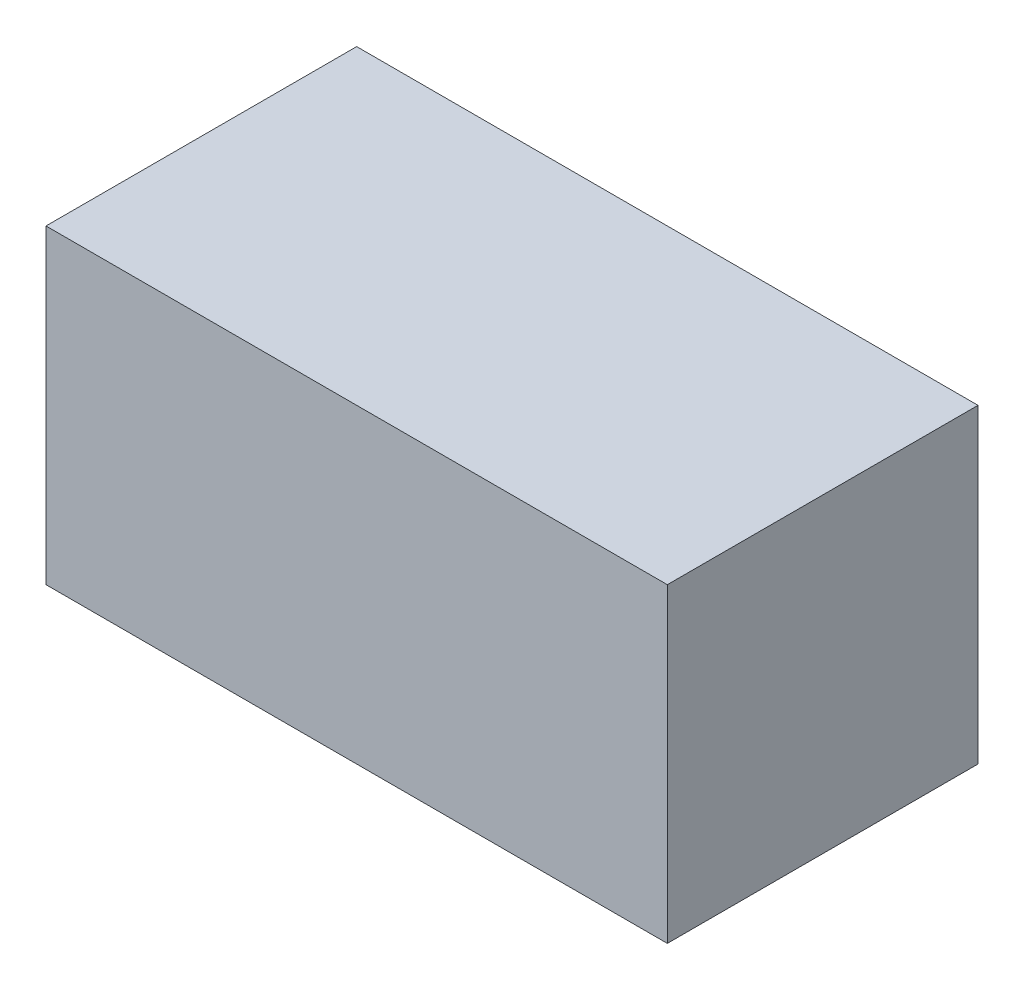
ISO-10303-21;
HEADER;
FILE_DESCRIPTION(('STEP AP214'),'2;1');
FILE_NAME('part.step','',(''),(''),'','','');
FILE_SCHEMA(('AUTOMOTIVE_DESIGN { 1 0 10303 214 1 1 1 1 }'));
ENDSEC;
DATA;
#1=APPLICATION_CONTEXT('core data for automotive mechanical design processes');
#2=APPLICATION_PROTOCOL_DEFINITION('international standard','automotive_design',2000,#1);
#3=PRODUCT_CONTEXT('',#1,'mechanical');
#4=PRODUCT('Part','Part','',(#3));
#5=PRODUCT_RELATED_PRODUCT_CATEGORY('part','',(#4));
#6=PRODUCT_DEFINITION_FORMATION('','',#4);
#7=PRODUCT_DEFINITION_CONTEXT('part definition',#1,'design');
#8=PRODUCT_DEFINITION('design','',#6,#7);
#9=PRODUCT_DEFINITION_SHAPE('','',#8);
#10=(LENGTH_UNIT() NAMED_UNIT(*) SI_UNIT(.MILLI.,.METRE.));
#11=(NAMED_UNIT(*) PLANE_ANGLE_UNIT() SI_UNIT($,.RADIAN.));
#12=(NAMED_UNIT(*) SI_UNIT($,.STERADIAN.) SOLID_ANGLE_UNIT());
#13=UNCERTAINTY_MEASURE_WITH_UNIT(LENGTH_MEASURE(1.E-05),#10,'distance_accuracy_value','');
#14=(GEOMETRIC_REPRESENTATION_CONTEXT(3) GLOBAL_UNCERTAINTY_ASSIGNED_CONTEXT((#13)) GLOBAL_UNIT_ASSIGNED_CONTEXT((#10,
#11,#12)) REPRESENTATION_CONTEXT('',''));
#15=CARTESIAN_POINT('',(0.,0.,0.));
#16=DIRECTION('',(0.,0.,1.));
#17=DIRECTION('',(1.,0.,0.));
#18=AXIS2_PLACEMENT_3D('',#15,#16,#17);
#19=CARTESIAN_POINT('',(45.,45.,-45.));
#20=DIRECTION('',(-1.,0.,0.));
#21=DIRECTION('',(0.,0.,1.));
#22=AXIS2_PLACEMENT_3D('',#19,#20,#21);
#23=PLANE('',#22);
#24=DIRECTION('',(0.,0.,-1.));
#25=VECTOR('',#24,1.);
#26=CARTESIAN_POINT('',(45.,0.,-45.));
#27=LINE('',#26,#25);
#28=CARTESIAN_POINT('',(45.,0.,0.));
#29=VERTEX_POINT('',#28);
#30=CARTESIAN_POINT('',(45.,0.,-45.));
#31=VERTEX_POINT('',#30);
#32=EDGE_CURVE('E96',#29,#31,#27,.T.);
#33=ORIENTED_EDGE('',*,*,#32,.T.);
#34=DIRECTION('',(0.,-1.,0.));
#35=VECTOR('',#34,1.);
#36=CARTESIAN_POINT('',(45.,45.,-45.));
#37=LINE('',#36,#35);
#38=CARTESIAN_POINT('',(45.,45.,-45.));
#39=VERTEX_POINT('',#38);
#40=EDGE_CURVE('E50',#39,#31,#37,.T.);
#41=ORIENTED_EDGE('',*,*,#40,.F.);
#42=DIRECTION('',(0.,0.,-1.));
#43=VECTOR('',#42,1.);
#44=CARTESIAN_POINT('',(45.,45.,-45.));
#45=LINE('',#44,#43);
#46=CARTESIAN_POINT('',(45.,45.,0.));
#47=VERTEX_POINT('',#46);
#48=EDGE_CURVE('E88',#47,#39,#45,.T.);
#49=ORIENTED_EDGE('',*,*,#48,.F.);
#50=DIRECTION('',(0.,-1.,0.));
#51=VECTOR('',#50,1.);
#52=CARTESIAN_POINT('',(45.,45.,0.));
#53=LINE('',#52,#51);
#54=EDGE_CURVE('E11',#47,#29,#53,.T.);
#55=ORIENTED_EDGE('',*,*,#54,.T.);
#56=EDGE_LOOP('',(#33,#41,#49,#55));
#57=FACE_BOUND('',#56,.T.);
#58=ADVANCED_FACE('F42',(#57),#23,.F.);
#59=CARTESIAN_POINT('',(-45.,45.,-45.));
#60=DIRECTION('',(0.,0.,1.));
#61=DIRECTION('',(1.,0.,0.));
#62=AXIS2_PLACEMENT_3D('',#59,#60,#61);
#63=PLANE('',#62);
#64=DIRECTION('',(-1.,0.,0.));
#65=VECTOR('',#64,1.);
#66=CARTESIAN_POINT('',(-45.,0.,-45.));
#67=LINE('',#66,#65);
#68=CARTESIAN_POINT('',(-45.,0.,-45.));
#69=VERTEX_POINT('',#68);
#70=EDGE_CURVE('E75',#31,#69,#67,.T.);
#71=ORIENTED_EDGE('',*,*,#70,.T.);
#72=DIRECTION('',(0.,-1.,0.));
#73=VECTOR('',#72,1.);
#74=CARTESIAN_POINT('',(-45.,45.,-45.));
#75=LINE('',#74,#73);
#76=CARTESIAN_POINT('',(-45.,45.,-45.));
#77=VERTEX_POINT('',#76);
#78=EDGE_CURVE('E97',#77,#69,#75,.T.);
#79=ORIENTED_EDGE('',*,*,#78,.F.);
#80=DIRECTION('',(-1.,0.,0.));
#81=VECTOR('',#80,1.);
#82=CARTESIAN_POINT('',(9.67289719626164,45.,-45.));
#83=LINE('',#82,#81);
#84=EDGE_CURVE('E92',#39,#77,#83,.T.);
#85=ORIENTED_EDGE('',*,*,#84,.F.);
#86=ORIENTED_EDGE('',*,*,#40,.T.);
#87=EDGE_LOOP('',(#71,#79,#85,#86));
#88=FACE_BOUND('',#87,.T.);
#89=ADVANCED_FACE('F98',(#88),#63,.F.);
#90=CARTESIAN_POINT('',(-45.,45.,0.));
#91=DIRECTION('',(1.,0.,0.));
#92=DIRECTION('',(0.,0.,-1.));
#93=AXIS2_PLACEMENT_3D('',#90,#91,#92);
#94=PLANE('',#93);
#95=DIRECTION('',(0.,0.,1.));
#96=VECTOR('',#95,1.);
#97=CARTESIAN_POINT('',(-45.,0.,0.));
#98=LINE('',#97,#96);
#99=CARTESIAN_POINT('',(-45.,0.,0.));
#100=VERTEX_POINT('',#99);
#101=EDGE_CURVE('E82',#69,#100,#98,.T.);
#102=ORIENTED_EDGE('',*,*,#101,.T.);
#103=DIRECTION('',(0.,-1.,0.));
#104=VECTOR('',#103,1.);
#105=CARTESIAN_POINT('',(-45.,45.,0.));
#106=LINE('',#105,#104);
#107=CARTESIAN_POINT('',(-45.,45.,0.));
#108=VERTEX_POINT('',#107);
#109=EDGE_CURVE('E102',#108,#100,#106,.T.);
#110=ORIENTED_EDGE('',*,*,#109,.F.);
#111=DIRECTION('',(0.,0.,1.));
#112=VECTOR('',#111,1.);
#113=CARTESIAN_POINT('',(-45.,45.,0.));
#114=LINE('',#113,#112);
#115=EDGE_CURVE('E100',#77,#108,#114,.T.);
#116=ORIENTED_EDGE('',*,*,#115,.F.);
#117=ORIENTED_EDGE('',*,*,#78,.T.);
#118=EDGE_LOOP('',(#102,#110,#116,#117));
#119=FACE_BOUND('',#118,.T.);
#120=ADVANCED_FACE('F112',(#119),#94,.F.);
#121=CARTESIAN_POINT('',(0.,45.,0.));
#122=DIRECTION('',(0.,0.,-1.));
#123=DIRECTION('',(-1.,0.,0.));
#124=AXIS2_PLACEMENT_3D('',#121,#122,#123);
#125=PLANE('',#124);
#126=DIRECTION('',(1.,0.,0.));
#127=VECTOR('',#126,1.);
#128=CARTESIAN_POINT('',(0.,0.,0.));
#129=LINE('',#128,#127);
#130=EDGE_CURVE('E109',#100,#29,#129,.T.);
#131=ORIENTED_EDGE('',*,*,#130,.T.);
#132=ORIENTED_EDGE('',*,*,#54,.F.);
#133=DIRECTION('',(1.,0.,0.));
#134=VECTOR('',#133,1.);
#135=CARTESIAN_POINT('',(45.,45.,0.));
#136=LINE('',#135,#134);
#137=EDGE_CURVE('E58',#108,#47,#136,.T.);
#138=ORIENTED_EDGE('',*,*,#137,.F.);
#139=ORIENTED_EDGE('',*,*,#109,.T.);
#140=EDGE_LOOP('',(#131,#132,#138,#139));
#141=FACE_BOUND('',#140,.T.);
#142=ADVANCED_FACE('F116',(#141),#125,.F.);
#143=CARTESIAN_POINT('',(0.,45.,0.));
#144=DIRECTION('',(0.,-1.,0.));
#145=DIRECTION('',(0.,0.,-1.));
#146=AXIS2_PLACEMENT_3D('',#143,#144,#145);
#147=PLANE('',#146);
#148=ORIENTED_EDGE('',*,*,#137,.T.);
#149=ORIENTED_EDGE('',*,*,#48,.T.);
#150=ORIENTED_EDGE('',*,*,#84,.T.);
#151=ORIENTED_EDGE('',*,*,#115,.T.);
#152=EDGE_LOOP('',(#148,#149,#150,#151));
#153=FACE_BOUND('',#152,.T.);
#154=ADVANCED_FACE('F90',(#153),#147,.F.);
#155=CARTESIAN_POINT('',(0.,0.,0.));
#156=DIRECTION('',(0.,-1.,0.));
#157=DIRECTION('',(0.,0.,-1.));
#158=AXIS2_PLACEMENT_3D('',#155,#156,#157);
#159=PLANE('',#158);
#160=ORIENTED_EDGE('',*,*,#32,.F.);
#161=ORIENTED_EDGE('',*,*,#130,.F.);
#162=ORIENTED_EDGE('',*,*,#101,.F.);
#163=ORIENTED_EDGE('',*,*,#70,.F.);
#164=EDGE_LOOP('',(#160,#161,#162,#163));
#165=FACE_BOUND('',#164,.T.);
#166=ADVANCED_FACE('F115',(#165),#159,.T.);
#167=CLOSED_SHELL('',(#58,#89,#120,#142,#154,#166));
#168=MANIFOLD_SOLID_BREP('B2',#167);
#169=ADVANCED_BREP_SHAPE_REPRESENTATION('',(#18,#168),#14);
#170=SHAPE_DEFINITION_REPRESENTATION(#9,#169);
ENDSEC;
END-ISO-10303-21;
